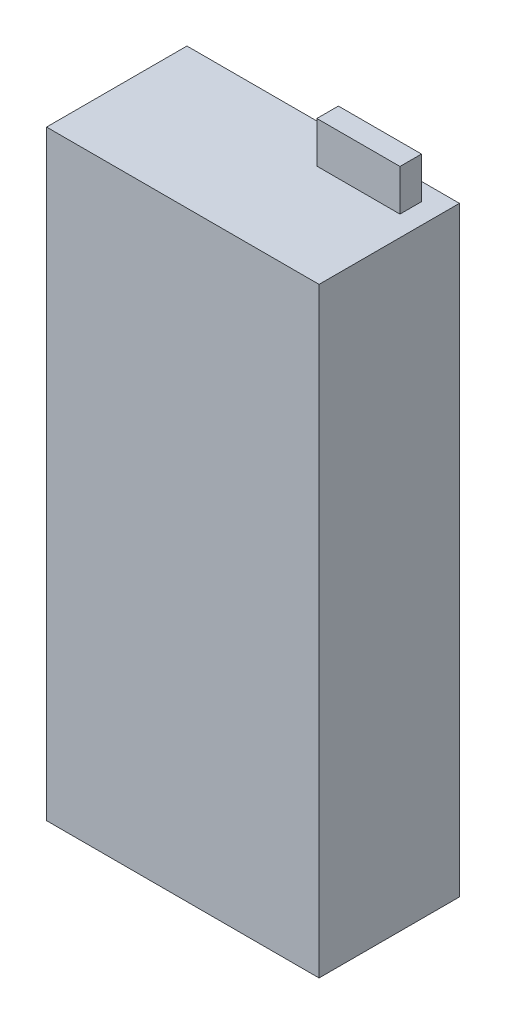
ISO-10303-21;
HEADER;
FILE_DESCRIPTION(('STEP AP214'),'2;1');
FILE_NAME('part.step','',(''),(''),'','','');
FILE_SCHEMA(('AUTOMOTIVE_DESIGN { 1 0 10303 214 1 1 1 1 }'));
ENDSEC;
DATA;
#1=APPLICATION_CONTEXT('core data for automotive mechanical design processes');
#2=APPLICATION_PROTOCOL_DEFINITION('international standard','automotive_design',2000,#1);
#3=PRODUCT_CONTEXT('',#1,'mechanical');
#4=PRODUCT('Part','Part','',(#3));
#5=PRODUCT_RELATED_PRODUCT_CATEGORY('part','',(#4));
#6=PRODUCT_DEFINITION_FORMATION('','',#4);
#7=PRODUCT_DEFINITION_CONTEXT('part definition',#1,'design');
#8=PRODUCT_DEFINITION('design','',#6,#7);
#9=PRODUCT_DEFINITION_SHAPE('','',#8);
#10=(LENGTH_UNIT() NAMED_UNIT(*) SI_UNIT(.MILLI.,.METRE.));
#11=(NAMED_UNIT(*) PLANE_ANGLE_UNIT() SI_UNIT($,.RADIAN.));
#12=(NAMED_UNIT(*) SI_UNIT($,.STERADIAN.) SOLID_ANGLE_UNIT());
#13=UNCERTAINTY_MEASURE_WITH_UNIT(LENGTH_MEASURE(1.E-05),#10,'distance_accuracy_value','');
#14=(GEOMETRIC_REPRESENTATION_CONTEXT(3) GLOBAL_UNCERTAINTY_ASSIGNED_CONTEXT((#13)) GLOBAL_UNIT_ASSIGNED_CONTEXT((#10,
#11,#12)) REPRESENTATION_CONTEXT('',''));
#15=CARTESIAN_POINT('',(0.,0.,0.));
#16=DIRECTION('',(0.,0.,1.));
#17=DIRECTION('',(1.,0.,0.));
#18=AXIS2_PLACEMENT_3D('',#15,#16,#17);
#19=CARTESIAN_POINT('',(-193.074626865671,287.149253731343,68.));
#20=DIRECTION('',(0.,-1.,0.));
#21=DIRECTION('',(0.,0.,-1.));
#22=AXIS2_PLACEMENT_3D('',#19,#20,#21);
#23=PLANE('',#22);
#24=DIRECTION('',(-1.,0.,0.));
#25=VECTOR('',#24,1.);
#26=CARTESIAN_POINT('',(-193.074626865671,287.149253731343,0.));
#27=LINE('',#26,#25);
#28=CARTESIAN_POINT('',(-61.0746268656714,287.149253731343,0.));
#29=VERTEX_POINT('',#28);
#30=CARTESIAN_POINT('',(-193.074626865671,287.149253731343,0.));
#31=VERTEX_POINT('',#30);
#32=EDGE_CURVE('E246',#29,#31,#27,.T.);
#33=ORIENTED_EDGE('',*,*,#32,.T.);
#34=DIRECTION('',(0.,0.,-1.));
#35=VECTOR('',#34,1.);
#36=CARTESIAN_POINT('',(-193.074626865671,287.149253731343,68.));
#37=LINE('',#36,#35);
#38=CARTESIAN_POINT('',(-193.074626865671,287.149253731343,68.));
#39=VERTEX_POINT('',#38);
#40=EDGE_CURVE('E256',#39,#31,#37,.T.);
#41=ORIENTED_EDGE('',*,*,#40,.F.);
#42=DIRECTION('',(-1.,0.,0.));
#43=VECTOR('',#42,1.);
#44=CARTESIAN_POINT('',(-193.074626865671,287.149253731343,68.));
#45=LINE('',#44,#43);
#46=CARTESIAN_POINT('',(-61.0746268656714,287.149253731343,68.));
#47=VERTEX_POINT('',#46);
#48=EDGE_CURVE('E236',#47,#39,#45,.T.);
#49=ORIENTED_EDGE('',*,*,#48,.F.);
#50=DIRECTION('',(0.,0.,-1.));
#51=VECTOR('',#50,1.);
#52=CARTESIAN_POINT('',(-61.0746268656714,287.149253731343,68.));
#53=LINE('',#52,#51);
#54=EDGE_CURVE('E41',#47,#29,#53,.T.);
#55=ORIENTED_EDGE('',*,*,#54,.T.);
#56=EDGE_LOOP('',(#33,#41,#49,#55));
#57=FACE_BOUND('',#56,.T.);
#58=DIRECTION('',(0.,0.,-1.));
#59=VECTOR('',#58,1.);
#60=CARTESIAN_POINT('',(-70.9483850455754,287.149253731343,18.9315760103987));
#61=LINE('',#60,#59);
#62=CARTESIAN_POINT('',(-70.9483850455754,287.149253731343,18.9315760103987));
#63=VERTEX_POINT('',#62);
#64=CARTESIAN_POINT('',(-70.9483850455754,287.149253731343,8.50918604596274));
#65=VERTEX_POINT('',#64);
#66=EDGE_CURVE('E142',#63,#65,#61,.T.);
#67=ORIENTED_EDGE('',*,*,#66,.F.);
#68=DIRECTION('',(1.,0.,0.));
#69=VECTOR('',#68,1.);
#70=CARTESIAN_POINT('',(-70.9483850455754,287.149253731343,18.9315760103987));
#71=LINE('',#70,#69);
#72=CARTESIAN_POINT('',(-111.202194247014,287.149253731343,18.9315760103987));
#73=VERTEX_POINT('',#72);
#74=EDGE_CURVE('E139',#73,#63,#71,.T.);
#75=ORIENTED_EDGE('',*,*,#74,.F.);
#76=DIRECTION('',(0.,0.,1.));
#77=VECTOR('',#76,1.);
#78=CARTESIAN_POINT('',(-111.202194247014,287.149253731343,18.9315760103987));
#79=LINE('',#78,#77);
#80=CARTESIAN_POINT('',(-111.202194247014,287.149253731343,8.50918604596274));
#81=VERTEX_POINT('',#80);
#82=EDGE_CURVE('E53',#81,#73,#79,.T.);
#83=ORIENTED_EDGE('',*,*,#82,.F.);
#84=DIRECTION('',(-1.,0.,0.));
#85=VECTOR('',#84,1.);
#86=CARTESIAN_POINT('',(-70.9483850455754,287.149253731343,8.50918604596274));
#87=LINE('',#86,#85);
#88=EDGE_CURVE('E48',#65,#81,#87,.T.);
#89=ORIENTED_EDGE('',*,*,#88,.F.);
#90=EDGE_LOOP('',(#67,#75,#83,#89));
#91=FACE_BOUND('',#90,.T.);
#92=ADVANCED_FACE('F33',(#57,#91),#23,.F.);
#93=CARTESIAN_POINT('',(-193.074626865671,-3.85074626865733,68.));
#94=DIRECTION('',(0.,1.,0.));
#95=DIRECTION('',(0.,0.,1.));
#96=AXIS2_PLACEMENT_3D('',#93,#94,#95);
#97=PLANE('',#96);
#98=CARTESIAN_POINT('',(-94.2518577073983,-3.85074626865733,37.5871900616787));
#99=DIRECTION('',(0.,1.,0.));
#100=DIRECTION('',(0.,0.,1.));
#101=AXIS2_PLACEMENT_3D('',#98,#99,#100);
#102=CIRCLE('',#101,24.1206050750484);
#103=CARTESIAN_POINT('',(-94.2518577073983,-3.85074626865733,61.707795136727));
#104=VERTEX_POINT('',#103);
#105=EDGE_CURVE('E11',#104,#104,#102,.F.);
#106=ORIENTED_EDGE('',*,*,#105,.F.);
#107=EDGE_LOOP('',(#106));
#108=FACE_BOUND('',#107,.T.);
#109=DIRECTION('',(1.,0.,0.));
#110=VECTOR('',#109,1.);
#111=CARTESIAN_POINT('',(-193.074626865671,-3.85074626865733,0.));
#112=LINE('',#111,#110);
#113=CARTESIAN_POINT('',(-193.074626865671,-3.85074626865733,0.));
#114=VERTEX_POINT('',#113);
#115=CARTESIAN_POINT('',(-61.0746268656714,-3.85074626865733,0.));
#116=VERTEX_POINT('',#115);
#117=EDGE_CURVE('E237',#114,#116,#112,.T.);
#118=ORIENTED_EDGE('',*,*,#117,.T.);
#119=DIRECTION('',(0.,0.,-1.));
#120=VECTOR('',#119,1.);
#121=CARTESIAN_POINT('',(-61.0746268656714,-3.85074626865733,68.));
#122=LINE('',#121,#120);
#123=CARTESIAN_POINT('',(-61.0746268656714,-3.85074626865733,68.));
#124=VERTEX_POINT('',#123);
#125=EDGE_CURVE('E243',#124,#116,#122,.T.);
#126=ORIENTED_EDGE('',*,*,#125,.F.);
#127=DIRECTION('',(1.,0.,0.));
#128=VECTOR('',#127,1.);
#129=CARTESIAN_POINT('',(-193.074626865671,-3.85074626865733,68.));
#130=LINE('',#129,#128);
#131=CARTESIAN_POINT('',(-193.074626865671,-3.85074626865733,68.));
#132=VERTEX_POINT('',#131);
#133=EDGE_CURVE('E241',#132,#124,#130,.T.);
#134=ORIENTED_EDGE('',*,*,#133,.F.);
#135=DIRECTION('',(0.,0.,-1.));
#136=VECTOR('',#135,1.);
#137=CARTESIAN_POINT('',(-193.074626865671,-3.85074626865733,68.));
#138=LINE('',#137,#136);
#139=EDGE_CURVE('E253',#132,#114,#138,.T.);
#140=ORIENTED_EDGE('',*,*,#139,.T.);
#141=EDGE_LOOP('',(#118,#126,#134,#140));
#142=FACE_BOUND('',#141,.T.);
#143=DIRECTION('',(0.,0.,-1.));
#144=VECTOR('',#143,1.);
#145=CARTESIAN_POINT('',(-178.598349927007,-3.85074626865733,24.2213644367162));
#146=LINE('',#145,#144);
#147=CARTESIAN_POINT('',(-178.598349927007,-3.85074626865733,24.2213644367162));
#148=VERTEX_POINT('',#147);
#149=CARTESIAN_POINT('',(-178.598349927007,-3.85074626865733,14.0191888236423));
#150=VERTEX_POINT('',#149);
#151=EDGE_CURVE('E146',#148,#150,#146,.T.);
#152=ORIENTED_EDGE('',*,*,#151,.F.);
#153=DIRECTION('',(-1.,0.,0.));
#154=VECTOR('',#153,1.);
#155=CARTESIAN_POINT('',(-178.598349927007,-3.85074626865733,24.2213644367162));
#156=LINE('',#155,#154);
#157=CARTESIAN_POINT('',(-125.545069393354,-3.85074626865733,24.2213644367162));
#158=VERTEX_POINT('',#157);
#159=EDGE_CURVE('E156',#158,#148,#156,.T.);
#160=ORIENTED_EDGE('',*,*,#159,.F.);
#161=DIRECTION('',(0.,0.,1.));
#162=VECTOR('',#161,1.);
#163=CARTESIAN_POINT('',(-125.545069393354,-3.85074626865733,24.2213644367162));
#164=LINE('',#163,#162);
#165=CARTESIAN_POINT('',(-125.545069393354,-3.85074626865733,14.0191888236423));
#166=VERTEX_POINT('',#165);
#167=EDGE_CURVE('E168',#166,#158,#164,.T.);
#168=ORIENTED_EDGE('',*,*,#167,.F.);
#169=DIRECTION('',(1.,0.,0.));
#170=VECTOR('',#169,1.);
#171=CARTESIAN_POINT('',(-178.598349927007,-3.85074626865733,14.0191888236423));
#172=LINE('',#171,#170);
#173=EDGE_CURVE('E165',#150,#166,#172,.T.);
#174=ORIENTED_EDGE('',*,*,#173,.F.);
#175=EDGE_LOOP('',(#152,#160,#168,#174));
#176=FACE_BOUND('',#175,.T.);
#177=ADVANCED_FACE('F276',(#108,#142,#176),#97,.F.);
#178=CARTESIAN_POINT('',(-61.0746268656714,287.149253731343,68.));
#179=DIRECTION('',(-1.,0.,0.));
#180=DIRECTION('',(0.,-1.,0.));
#181=AXIS2_PLACEMENT_3D('',#178,#179,#180);
#182=PLANE('',#181);
#183=DIRECTION('',(0.,1.,0.));
#184=VECTOR('',#183,1.);
#185=CARTESIAN_POINT('',(-61.0746268656714,287.149253731343,0.));
#186=LINE('',#185,#184);
#187=EDGE_CURVE('E230',#116,#29,#186,.T.);
#188=ORIENTED_EDGE('',*,*,#187,.T.);
#189=ORIENTED_EDGE('',*,*,#54,.F.);
#190=DIRECTION('',(0.,1.,0.));
#191=VECTOR('',#190,1.);
#192=CARTESIAN_POINT('',(-61.0746268656714,287.149253731343,68.));
#193=LINE('',#192,#191);
#194=EDGE_CURVE('E233',#124,#47,#193,.T.);
#195=ORIENTED_EDGE('',*,*,#194,.F.);
#196=ORIENTED_EDGE('',*,*,#125,.T.);
#197=EDGE_LOOP('',(#188,#189,#195,#196));
#198=FACE_BOUND('',#197,.T.);
#199=ADVANCED_FACE('F35',(#198),#182,.F.);
#200=CARTESIAN_POINT('',(-193.074626865671,287.149253731343,68.));
#201=DIRECTION('',(1.,0.,0.));
#202=DIRECTION('',(0.,1.,0.));
#203=AXIS2_PLACEMENT_3D('',#200,#201,#202);
#204=PLANE('',#203);
#205=CARTESIAN_POINT('',(-193.074626865671,23.1492537313427,55.5));
#206=DIRECTION('',(-1.,0.,0.));
#207=DIRECTION('',(0.,-1.,0.));
#208=AXIS2_PLACEMENT_3D('',#205,#206,#207);
#209=CIRCLE('',#208,2.);
#210=CARTESIAN_POINT('',(-193.074626865671,21.1492537313427,55.5));
#211=VERTEX_POINT('',#210);
#212=EDGE_CURVE('E207',#211,#211,#209,.T.);
#213=ORIENTED_EDGE('',*,*,#212,.F.);
#214=EDGE_LOOP('',(#213));
#215=FACE_BOUND('',#214,.T.);
#216=CARTESIAN_POINT('',(-193.074626865671,33.1492537313427,55.5));
#217=DIRECTION('',(-1.,0.,0.));
#218=DIRECTION('',(0.,-1.,0.));
#219=AXIS2_PLACEMENT_3D('',#216,#217,#218);
#220=CIRCLE('',#219,2.);
#221=CARTESIAN_POINT('',(-193.074626865671,31.1492537313427,55.5));
#222=VERTEX_POINT('',#221);
#223=EDGE_CURVE('E213',#222,#222,#220,.T.);
#224=ORIENTED_EDGE('',*,*,#223,.F.);
#225=EDGE_LOOP('',(#224));
#226=FACE_BOUND('',#225,.T.);
#227=CARTESIAN_POINT('',(-193.074626865671,33.1492537313427,17.5));
#228=DIRECTION('',(-1.,0.,0.));
#229=DIRECTION('',(0.,-1.,0.));
#230=AXIS2_PLACEMENT_3D('',#227,#228,#229);
#231=CIRCLE('',#230,2.);
#232=CARTESIAN_POINT('',(-193.074626865671,31.1492537313427,17.5));
#233=VERTEX_POINT('',#232);
#234=EDGE_CURVE('E219',#233,#233,#231,.T.);
#235=ORIENTED_EDGE('',*,*,#234,.F.);
#236=EDGE_LOOP('',(#235));
#237=FACE_BOUND('',#236,.T.);
#238=CARTESIAN_POINT('',(-193.074626865671,269.449253731343,17.5));
#239=DIRECTION('',(-1.,0.,0.));
#240=DIRECTION('',(0.,1.,0.));
#241=AXIS2_PLACEMENT_3D('',#238,#239,#240);
#242=CIRCLE('',#241,2.00000000000001);
#243=CARTESIAN_POINT('',(-193.074626865671,271.449253731343,17.5));
#244=VERTEX_POINT('',#243);
#245=EDGE_CURVE('E188',#244,#244,#242,.T.);
#246=ORIENTED_EDGE('',*,*,#245,.F.);
#247=EDGE_LOOP('',(#246));
#248=FACE_BOUND('',#247,.T.);
#249=CARTESIAN_POINT('',(-193.074626865671,259.449253731343,17.5));
#250=DIRECTION('',(-1.,0.,0.));
#251=DIRECTION('',(0.,1.,0.));
#252=AXIS2_PLACEMENT_3D('',#249,#250,#251);
#253=CIRCLE('',#252,2.);
#254=CARTESIAN_POINT('',(-193.074626865671,261.449253731343,17.5));
#255=VERTEX_POINT('',#254);
#256=EDGE_CURVE('E189',#255,#255,#253,.T.);
#257=ORIENTED_EDGE('',*,*,#256,.F.);
#258=EDGE_LOOP('',(#257));
#259=FACE_BOUND('',#258,.T.);
#260=CARTESIAN_POINT('',(-193.074626865671,259.449253731343,55.5));
#261=DIRECTION('',(-1.,0.,0.));
#262=DIRECTION('',(0.,1.,0.));
#263=AXIS2_PLACEMENT_3D('',#260,#261,#262);
#264=CIRCLE('',#263,2.);
#265=CARTESIAN_POINT('',(-193.074626865671,261.449253731343,55.5));
#266=VERTEX_POINT('',#265);
#267=EDGE_CURVE('E195',#266,#266,#264,.T.);
#268=ORIENTED_EDGE('',*,*,#267,.F.);
#269=EDGE_LOOP('',(#268));
#270=FACE_BOUND('',#269,.T.);
#271=CARTESIAN_POINT('',(-193.074626865671,269.449253731343,55.5));
#272=DIRECTION('',(-1.,0.,0.));
#273=DIRECTION('',(0.,1.,0.));
#274=AXIS2_PLACEMENT_3D('',#271,#272,#273);
#275=CIRCLE('',#274,2.);
#276=CARTESIAN_POINT('',(-193.074626865671,271.449253731343,55.5));
#277=VERTEX_POINT('',#276);
#278=EDGE_CURVE('E184',#277,#277,#275,.T.);
#279=ORIENTED_EDGE('',*,*,#278,.F.);
#280=EDGE_LOOP('',(#279));
#281=FACE_BOUND('',#280,.T.);
#282=CARTESIAN_POINT('',(-193.074626865671,23.1492537313427,17.5));
#283=DIRECTION('',(-1.,0.,0.));
#284=DIRECTION('',(0.,-1.,0.));
#285=AXIS2_PLACEMENT_3D('',#282,#283,#284);
#286=CIRCLE('',#285,2.);
#287=CARTESIAN_POINT('',(-193.074626865671,21.1492537313427,17.5));
#288=VERTEX_POINT('',#287);
#289=EDGE_CURVE('E206',#288,#288,#286,.T.);
#290=ORIENTED_EDGE('',*,*,#289,.F.);
#291=EDGE_LOOP('',(#290));
#292=FACE_BOUND('',#291,.T.);
#293=DIRECTION('',(0.,-1.,0.));
#294=VECTOR('',#293,1.);
#295=CARTESIAN_POINT('',(-193.074626865671,287.149253731343,0.));
#296=LINE('',#295,#294);
#297=EDGE_CURVE('E248',#31,#114,#296,.T.);
#298=ORIENTED_EDGE('',*,*,#297,.T.);
#299=ORIENTED_EDGE('',*,*,#139,.F.);
#300=DIRECTION('',(0.,-1.,0.));
#301=VECTOR('',#300,1.);
#302=CARTESIAN_POINT('',(-193.074626865671,287.149253731343,68.));
#303=LINE('',#302,#301);
#304=EDGE_CURVE('E239',#39,#132,#303,.T.);
#305=ORIENTED_EDGE('',*,*,#304,.F.);
#306=ORIENTED_EDGE('',*,*,#40,.T.);
#307=EDGE_LOOP('',(#298,#299,#305,#306));
#308=FACE_BOUND('',#307,.T.);
#309=ADVANCED_FACE('F272',(#215,#226,#237,#248,#259,#270,#281,#292,#308),#204,.F.);
#310=CARTESIAN_POINT('',(0.,0.,68.));
#311=DIRECTION('',(0.,0.,1.));
#312=DIRECTION('',(1.,0.,0.));
#313=AXIS2_PLACEMENT_3D('',#310,#311,#312);
#314=PLANE('',#313);
#315=ORIENTED_EDGE('',*,*,#194,.T.);
#316=ORIENTED_EDGE('',*,*,#48,.T.);
#317=ORIENTED_EDGE('',*,*,#304,.T.);
#318=ORIENTED_EDGE('',*,*,#133,.T.);
#319=EDGE_LOOP('',(#315,#316,#317,#318));
#320=FACE_BOUND('',#319,.T.);
#321=ADVANCED_FACE('F279',(#320),#314,.T.);
#322=CARTESIAN_POINT('',(0.,0.,0.));
#323=DIRECTION('',(0.,0.,1.));
#324=DIRECTION('',(1.,0.,0.));
#325=AXIS2_PLACEMENT_3D('',#322,#323,#324);
#326=PLANE('',#325);
#327=ORIENTED_EDGE('',*,*,#187,.F.);
#328=ORIENTED_EDGE('',*,*,#117,.F.);
#329=ORIENTED_EDGE('',*,*,#297,.F.);
#330=ORIENTED_EDGE('',*,*,#32,.F.);
#331=EDGE_LOOP('',(#327,#328,#329,#330));
#332=FACE_BOUND('',#331,.T.);
#333=ADVANCED_FACE('F268',(#332),#326,.F.);
#334=CARTESIAN_POINT('',(-189.074626865671,23.1492537313427,17.5));
#335=DIRECTION('',(-1.,0.,0.));
#336=DIRECTION('',(0.,-1.,0.));
#337=AXIS2_PLACEMENT_3D('',#334,#335,#336);
#338=CYLINDRICAL_SURFACE('',#337,2.);
#339=CARTESIAN_POINT('',(-189.074626865671,23.1492537313427,17.5));
#340=DIRECTION('',(-1.,0.,0.));
#341=DIRECTION('',(0.,-1.,0.));
#342=AXIS2_PLACEMENT_3D('',#339,#340,#341);
#343=CIRCLE('',#342,2.);
#344=CARTESIAN_POINT('',(-189.074626865671,21.1492537313427,17.5));
#345=VERTEX_POINT('',#344);
#346=EDGE_CURVE('E227',#345,#345,#343,.T.);
#347=ORIENTED_EDGE('',*,*,#346,.F.);
#348=EDGE_LOOP('',(#347));
#349=FACE_BOUND('',#348,.T.);
#350=ORIENTED_EDGE('',*,*,#289,.T.);
#351=EDGE_LOOP('',(#350));
#352=FACE_BOUND('',#351,.T.);
#353=ADVANCED_FACE('F286',(#349,#352),#338,.F.);
#354=CARTESIAN_POINT('',(-189.074626865671,23.1492537313427,17.5));
#355=DIRECTION('',(-1.,0.,0.));
#356=DIRECTION('',(0.,-1.,0.));
#357=AXIS2_PLACEMENT_3D('',#354,#355,#356);
#358=PLANE('',#357);
#359=ORIENTED_EDGE('',*,*,#346,.T.);
#360=EDGE_LOOP('',(#359));
#361=FACE_BOUND('',#360,.T.);
#362=ADVANCED_FACE('F360',(#361),#358,.T.);
#363=CARTESIAN_POINT('',(-189.074626865671,269.449253731343,55.5));
#364=DIRECTION('',(-1.,0.,0.));
#365=DIRECTION('',(0.,-1.,0.));
#366=AXIS2_PLACEMENT_3D('',#363,#364,#365);
#367=CYLINDRICAL_SURFACE('',#366,2.);
#368=CARTESIAN_POINT('',(-189.074626865671,269.449253731343,55.5));
#369=DIRECTION('',(-1.,0.,0.));
#370=DIRECTION('',(0.,1.,0.));
#371=AXIS2_PLACEMENT_3D('',#368,#369,#370);
#372=CIRCLE('',#371,2.);
#373=CARTESIAN_POINT('',(-189.074626865671,271.449253731343,55.5));
#374=VERTEX_POINT('',#373);
#375=EDGE_CURVE('E198',#374,#374,#372,.T.);
#376=ORIENTED_EDGE('',*,*,#375,.F.);
#377=EDGE_LOOP('',(#376));
#378=FACE_BOUND('',#377,.T.);
#379=ORIENTED_EDGE('',*,*,#278,.T.);
#380=EDGE_LOOP('',(#379));
#381=FACE_BOUND('',#380,.T.);
#382=ADVANCED_FACE('F356',(#378,#381),#367,.F.);
#383=CARTESIAN_POINT('',(-189.074626865671,269.449253731343,55.5));
#384=DIRECTION('',(1.,0.,0.));
#385=DIRECTION('',(0.,1.,0.));
#386=AXIS2_PLACEMENT_3D('',#383,#384,#385);
#387=PLANE('',#386);
#388=ORIENTED_EDGE('',*,*,#375,.T.);
#389=EDGE_LOOP('',(#388));
#390=FACE_BOUND('',#389,.T.);
#391=ADVANCED_FACE('F352',(#390),#387,.F.);
#392=CARTESIAN_POINT('',(-189.074626865671,259.449253731343,55.5));
#393=DIRECTION('',(-1.,0.,0.));
#394=DIRECTION('',(0.,-1.,0.));
#395=AXIS2_PLACEMENT_3D('',#392,#393,#394);
#396=CYLINDRICAL_SURFACE('',#395,2.);
#397=CARTESIAN_POINT('',(-189.074626865671,259.449253731343,55.5));
#398=DIRECTION('',(-1.,0.,0.));
#399=DIRECTION('',(0.,1.,0.));
#400=AXIS2_PLACEMENT_3D('',#397,#398,#399);
#401=CIRCLE('',#400,2.);
#402=CARTESIAN_POINT('',(-189.074626865671,261.449253731343,55.5));
#403=VERTEX_POINT('',#402);
#404=EDGE_CURVE('E192',#403,#403,#401,.T.);
#405=ORIENTED_EDGE('',*,*,#404,.F.);
#406=EDGE_LOOP('',(#405));
#407=FACE_BOUND('',#406,.T.);
#408=ORIENTED_EDGE('',*,*,#267,.T.);
#409=EDGE_LOOP('',(#408));
#410=FACE_BOUND('',#409,.T.);
#411=ADVANCED_FACE('F348',(#407,#410),#396,.F.);
#412=CARTESIAN_POINT('',(-189.074626865671,259.449253731343,55.5));
#413=DIRECTION('',(1.,0.,0.));
#414=DIRECTION('',(0.,1.,0.));
#415=AXIS2_PLACEMENT_3D('',#412,#413,#414);
#416=PLANE('',#415);
#417=ORIENTED_EDGE('',*,*,#404,.T.);
#418=EDGE_LOOP('',(#417));
#419=FACE_BOUND('',#418,.T.);
#420=ADVANCED_FACE('F344',(#419),#416,.F.);
#421=CARTESIAN_POINT('',(-189.074626865671,259.449253731343,17.5));
#422=DIRECTION('',(-1.,0.,0.));
#423=DIRECTION('',(0.,-1.,0.));
#424=AXIS2_PLACEMENT_3D('',#421,#422,#423);
#425=CYLINDRICAL_SURFACE('',#424,2.);
#426=CARTESIAN_POINT('',(-189.074626865671,259.449253731343,17.5));
#427=DIRECTION('',(-1.,0.,0.));
#428=DIRECTION('',(0.,1.,0.));
#429=AXIS2_PLACEMENT_3D('',#426,#427,#428);
#430=CIRCLE('',#429,2.);
#431=CARTESIAN_POINT('',(-189.074626865671,261.449253731343,17.5));
#432=VERTEX_POINT('',#431);
#433=EDGE_CURVE('E185',#432,#432,#430,.T.);
#434=ORIENTED_EDGE('',*,*,#433,.F.);
#435=EDGE_LOOP('',(#434));
#436=FACE_BOUND('',#435,.T.);
#437=ORIENTED_EDGE('',*,*,#256,.T.);
#438=EDGE_LOOP('',(#437));
#439=FACE_BOUND('',#438,.T.);
#440=ADVANCED_FACE('F340',(#436,#439),#425,.F.);
#441=CARTESIAN_POINT('',(-189.074626865671,259.449253731343,17.5));
#442=DIRECTION('',(1.,0.,0.));
#443=DIRECTION('',(0.,1.,0.));
#444=AXIS2_PLACEMENT_3D('',#441,#442,#443);
#445=PLANE('',#444);
#446=ORIENTED_EDGE('',*,*,#433,.T.);
#447=EDGE_LOOP('',(#446));
#448=FACE_BOUND('',#447,.T.);
#449=ADVANCED_FACE('F336',(#448),#445,.F.);
#450=CARTESIAN_POINT('',(-189.074626865671,269.449253731343,17.5));
#451=DIRECTION('',(-1.,0.,0.));
#452=DIRECTION('',(0.,-1.,0.));
#453=AXIS2_PLACEMENT_3D('',#450,#451,#452);
#454=CYLINDRICAL_SURFACE('',#453,2.00000000000001);
#455=CARTESIAN_POINT('',(-189.074626865671,269.449253731343,17.5));
#456=DIRECTION('',(-1.,0.,0.));
#457=DIRECTION('',(0.,1.,0.));
#458=AXIS2_PLACEMENT_3D('',#455,#456,#457);
#459=CIRCLE('',#458,2.00000000000001);
#460=CARTESIAN_POINT('',(-189.074626865671,271.449253731343,17.5));
#461=VERTEX_POINT('',#460);
#462=EDGE_CURVE('E222',#461,#461,#459,.T.);
#463=ORIENTED_EDGE('',*,*,#462,.F.);
#464=EDGE_LOOP('',(#463));
#465=FACE_BOUND('',#464,.T.);
#466=ORIENTED_EDGE('',*,*,#245,.T.);
#467=EDGE_LOOP('',(#466));
#468=FACE_BOUND('',#467,.T.);
#469=ADVANCED_FACE('F339',(#465,#468),#454,.F.);
#470=CARTESIAN_POINT('',(-189.074626865671,269.449253731343,17.5));
#471=DIRECTION('',(1.,0.,0.));
#472=DIRECTION('',(0.,1.,0.));
#473=AXIS2_PLACEMENT_3D('',#470,#471,#472);
#474=PLANE('',#473);
#475=ORIENTED_EDGE('',*,*,#462,.T.);
#476=EDGE_LOOP('',(#475));
#477=FACE_BOUND('',#476,.T.);
#478=ADVANCED_FACE('F384',(#477),#474,.F.);
#479=CARTESIAN_POINT('',(-189.074626865671,33.1492537313427,17.5));
#480=DIRECTION('',(-1.,0.,0.));
#481=DIRECTION('',(0.,-1.,0.));
#482=AXIS2_PLACEMENT_3D('',#479,#480,#481);
#483=CYLINDRICAL_SURFACE('',#482,2.);
#484=CARTESIAN_POINT('',(-189.074626865671,33.1492537313427,17.5));
#485=DIRECTION('',(-1.,0.,0.));
#486=DIRECTION('',(0.,-1.,0.));
#487=AXIS2_PLACEMENT_3D('',#484,#485,#486);
#488=CIRCLE('',#487,2.);
#489=CARTESIAN_POINT('',(-189.074626865671,31.1492537313427,17.5));
#490=VERTEX_POINT('',#489);
#491=EDGE_CURVE('E216',#490,#490,#488,.T.);
#492=ORIENTED_EDGE('',*,*,#491,.F.);
#493=EDGE_LOOP('',(#492));
#494=FACE_BOUND('',#493,.T.);
#495=ORIENTED_EDGE('',*,*,#234,.T.);
#496=EDGE_LOOP('',(#495));
#497=FACE_BOUND('',#496,.T.);
#498=ADVANCED_FACE('F380',(#494,#497),#483,.F.);
#499=CARTESIAN_POINT('',(-189.074626865671,33.1492537313427,17.5));
#500=DIRECTION('',(-1.,0.,0.));
#501=DIRECTION('',(0.,-1.,0.));
#502=AXIS2_PLACEMENT_3D('',#499,#500,#501);
#503=PLANE('',#502);
#504=ORIENTED_EDGE('',*,*,#491,.T.);
#505=EDGE_LOOP('',(#504));
#506=FACE_BOUND('',#505,.T.);
#507=ADVANCED_FACE('F376',(#506),#503,.T.);
#508=CARTESIAN_POINT('',(-189.074626865671,33.1492537313427,55.5));
#509=DIRECTION('',(-1.,0.,0.));
#510=DIRECTION('',(0.,-1.,0.));
#511=AXIS2_PLACEMENT_3D('',#508,#509,#510);
#512=CYLINDRICAL_SURFACE('',#511,2.);
#513=CARTESIAN_POINT('',(-189.074626865671,33.1492537313427,55.5));
#514=DIRECTION('',(-1.,0.,0.));
#515=DIRECTION('',(0.,-1.,0.));
#516=AXIS2_PLACEMENT_3D('',#513,#514,#515);
#517=CIRCLE('',#516,2.);
#518=CARTESIAN_POINT('',(-189.074626865671,31.1492537313427,55.5));
#519=VERTEX_POINT('',#518);
#520=EDGE_CURVE('E210',#519,#519,#517,.T.);
#521=ORIENTED_EDGE('',*,*,#520,.F.);
#522=EDGE_LOOP('',(#521));
#523=FACE_BOUND('',#522,.T.);
#524=ORIENTED_EDGE('',*,*,#223,.T.);
#525=EDGE_LOOP('',(#524));
#526=FACE_BOUND('',#525,.T.);
#527=ADVANCED_FACE('F372',(#523,#526),#512,.F.);
#528=CARTESIAN_POINT('',(-189.074626865671,33.1492537313427,55.5));
#529=DIRECTION('',(-1.,0.,0.));
#530=DIRECTION('',(0.,-1.,0.));
#531=AXIS2_PLACEMENT_3D('',#528,#529,#530);
#532=PLANE('',#531);
#533=ORIENTED_EDGE('',*,*,#520,.T.);
#534=EDGE_LOOP('',(#533));
#535=FACE_BOUND('',#534,.T.);
#536=ADVANCED_FACE('F368',(#535),#532,.T.);
#537=CARTESIAN_POINT('',(-189.074626865671,23.1492537313427,55.5));
#538=DIRECTION('',(-1.,0.,0.));
#539=DIRECTION('',(0.,-1.,0.));
#540=AXIS2_PLACEMENT_3D('',#537,#538,#539);
#541=CYLINDRICAL_SURFACE('',#540,2.);
#542=CARTESIAN_POINT('',(-189.074626865671,23.1492537313427,55.5));
#543=DIRECTION('',(-1.,0.,0.));
#544=DIRECTION('',(0.,-1.,0.));
#545=AXIS2_PLACEMENT_3D('',#542,#543,#544);
#546=CIRCLE('',#545,2.);
#547=CARTESIAN_POINT('',(-189.074626865671,21.1492537313427,55.5));
#548=VERTEX_POINT('',#547);
#549=EDGE_CURVE('E203',#548,#548,#546,.T.);
#550=ORIENTED_EDGE('',*,*,#549,.F.);
#551=EDGE_LOOP('',(#550));
#552=FACE_BOUND('',#551,.T.);
#553=ORIENTED_EDGE('',*,*,#212,.T.);
#554=EDGE_LOOP('',(#553));
#555=FACE_BOUND('',#554,.T.);
#556=ADVANCED_FACE('F364',(#552,#555),#541,.F.);
#557=CARTESIAN_POINT('',(-189.074626865671,23.1492537313427,55.5));
#558=DIRECTION('',(-1.,0.,0.));
#559=DIRECTION('',(0.,-1.,0.));
#560=AXIS2_PLACEMENT_3D('',#557,#558,#559);
#561=PLANE('',#560);
#562=ORIENTED_EDGE('',*,*,#549,.T.);
#563=EDGE_LOOP('',(#562));
#564=FACE_BOUND('',#563,.T.);
#565=ADVANCED_FACE('F334',(#564),#561,.T.);
#566=CARTESIAN_POINT('',(-178.598349927007,-23.8507462686573,24.2213644367162));
#567=DIRECTION('',(1.,0.,0.));
#568=DIRECTION('',(0.,0.,-1.));
#569=AXIS2_PLACEMENT_3D('',#566,#567,#568);
#570=PLANE('',#569);
#571=ORIENTED_EDGE('',*,*,#151,.T.);
#572=DIRECTION('',(0.,1.,0.));
#573=VECTOR('',#572,1.);
#574=CARTESIAN_POINT('',(-178.598349927007,-23.8507462686573,14.0191888236423));
#575=LINE('',#574,#573);
#576=CARTESIAN_POINT('',(-178.598349927007,-23.8507462686573,14.0191888236423));
#577=VERTEX_POINT('',#576);
#578=EDGE_CURVE('E181',#577,#150,#575,.T.);
#579=ORIENTED_EDGE('',*,*,#578,.F.);
#580=DIRECTION('',(0.,0.,-1.));
#581=VECTOR('',#580,1.);
#582=CARTESIAN_POINT('',(-178.598349927007,-23.8507462686573,24.2213644367162));
#583=LINE('',#582,#581);
#584=CARTESIAN_POINT('',(-178.598349927007,-23.8507462686573,24.2213644367162));
#585=VERTEX_POINT('',#584);
#586=EDGE_CURVE('E152',#585,#577,#583,.T.);
#587=ORIENTED_EDGE('',*,*,#586,.F.);
#588=DIRECTION('',(0.,1.,0.));
#589=VECTOR('',#588,1.);
#590=CARTESIAN_POINT('',(-178.598349927007,-23.8507462686573,24.2213644367162));
#591=LINE('',#590,#589);
#592=EDGE_CURVE('E162',#585,#148,#591,.T.);
#593=ORIENTED_EDGE('',*,*,#592,.T.);
#594=EDGE_LOOP('',(#571,#579,#587,#593));
#595=FACE_BOUND('',#594,.T.);
#596=ADVANCED_FACE('F330',(#595),#570,.F.);
#597=CARTESIAN_POINT('',(-178.598349927007,-23.8507462686573,14.0191888236423));
#598=DIRECTION('',(0.,0.,1.));
#599=DIRECTION('',(1.,0.,0.));
#600=AXIS2_PLACEMENT_3D('',#597,#598,#599);
#601=PLANE('',#600);
#602=ORIENTED_EDGE('',*,*,#173,.T.);
#603=DIRECTION('',(0.,1.,0.));
#604=VECTOR('',#603,1.);
#605=CARTESIAN_POINT('',(-125.545069393354,-23.8507462686573,14.0191888236423));
#606=LINE('',#605,#604);
#607=CARTESIAN_POINT('',(-125.545069393354,-23.8507462686573,14.0191888236423));
#608=VERTEX_POINT('',#607);
#609=EDGE_CURVE('E178',#608,#166,#606,.T.);
#610=ORIENTED_EDGE('',*,*,#609,.F.);
#611=DIRECTION('',(1.,0.,0.));
#612=VECTOR('',#611,1.);
#613=CARTESIAN_POINT('',(-178.598349927007,-23.8507462686573,14.0191888236423));
#614=LINE('',#613,#612);
#615=EDGE_CURVE('E155',#577,#608,#614,.T.);
#616=ORIENTED_EDGE('',*,*,#615,.F.);
#617=ORIENTED_EDGE('',*,*,#578,.T.);
#618=EDGE_LOOP('',(#602,#610,#616,#617));
#619=FACE_BOUND('',#618,.T.);
#620=ADVANCED_FACE('F326',(#619),#601,.F.);
#621=CARTESIAN_POINT('',(-125.545069393354,-23.8507462686573,24.2213644367162));
#622=DIRECTION('',(-1.,0.,0.));
#623=DIRECTION('',(0.,0.,1.));
#624=AXIS2_PLACEMENT_3D('',#621,#622,#623);
#625=PLANE('',#624);
#626=ORIENTED_EDGE('',*,*,#167,.T.);
#627=DIRECTION('',(0.,1.,0.));
#628=VECTOR('',#627,1.);
#629=CARTESIAN_POINT('',(-125.545069393354,-23.8507462686573,24.2213644367162));
#630=LINE('',#629,#628);
#631=CARTESIAN_POINT('',(-125.545069393354,-23.8507462686573,24.2213644367162));
#632=VERTEX_POINT('',#631);
#633=EDGE_CURVE('E175',#632,#158,#630,.T.);
#634=ORIENTED_EDGE('',*,*,#633,.F.);
#635=DIRECTION('',(0.,0.,1.));
#636=VECTOR('',#635,1.);
#637=CARTESIAN_POINT('',(-125.545069393354,-23.8507462686573,24.2213644367162));
#638=LINE('',#637,#636);
#639=EDGE_CURVE('E158',#608,#632,#638,.T.);
#640=ORIENTED_EDGE('',*,*,#639,.F.);
#641=ORIENTED_EDGE('',*,*,#609,.T.);
#642=EDGE_LOOP('',(#626,#634,#640,#641));
#643=FACE_BOUND('',#642,.T.);
#644=ADVANCED_FACE('F322',(#643),#625,.F.);
#645=CARTESIAN_POINT('',(-178.598349927007,-23.8507462686573,24.2213644367162));
#646=DIRECTION('',(0.,0.,-1.));
#647=DIRECTION('',(-1.,0.,0.));
#648=AXIS2_PLACEMENT_3D('',#645,#646,#647);
#649=PLANE('',#648);
#650=ORIENTED_EDGE('',*,*,#159,.T.);
#651=ORIENTED_EDGE('',*,*,#592,.F.);
#652=DIRECTION('',(-1.,0.,0.));
#653=VECTOR('',#652,1.);
#654=CARTESIAN_POINT('',(-178.598349927007,-23.8507462686573,24.2213644367162));
#655=LINE('',#654,#653);
#656=EDGE_CURVE('E160',#632,#585,#655,.T.);
#657=ORIENTED_EDGE('',*,*,#656,.F.);
#658=ORIENTED_EDGE('',*,*,#633,.T.);
#659=EDGE_LOOP('',(#650,#651,#657,#658));
#660=FACE_BOUND('',#659,.T.);
#661=ADVANCED_FACE('F314',(#660),#649,.F.);
#662=CARTESIAN_POINT('',(0.,-23.8507462686573,0.));
#663=DIRECTION('',(0.,-1.,0.));
#664=DIRECTION('',(0.,0.,-1.));
#665=AXIS2_PLACEMENT_3D('',#662,#663,#664);
#666=PLANE('',#665);
#667=ORIENTED_EDGE('',*,*,#586,.T.);
#668=ORIENTED_EDGE('',*,*,#615,.T.);
#669=ORIENTED_EDGE('',*,*,#639,.T.);
#670=ORIENTED_EDGE('',*,*,#656,.T.);
#671=EDGE_LOOP('',(#667,#668,#669,#670));
#672=FACE_BOUND('',#671,.T.);
#673=ADVANCED_FACE('F305',(#672),#666,.T.);
#674=CARTESIAN_POINT('',(-94.2518577073983,-8.85074626865734,37.5871900616787));
#675=DIRECTION('',(0.,1.,0.));
#676=DIRECTION('',(0.,0.,1.));
#677=AXIS2_PLACEMENT_3D('',#674,#675,#676);
#678=CYLINDRICAL_SURFACE('',#677,24.1206050750484);
#679=CARTESIAN_POINT('',(-94.2518577073983,-8.85074626865734,37.5871900616787));
#680=DIRECTION('',(0.,-1.,0.));
#681=DIRECTION('',(0.,0.,-1.));
#682=AXIS2_PLACEMENT_3D('',#679,#680,#681);
#683=CIRCLE('',#682,24.1206050750484);
#684=CARTESIAN_POINT('',(-94.2518577073983,-8.85074626865734,13.4665849866303));
#685=VERTEX_POINT('',#684);
#686=EDGE_CURVE('E143',#685,#685,#683,.T.);
#687=ORIENTED_EDGE('',*,*,#686,.F.);
#688=EDGE_LOOP('',(#687));
#689=FACE_BOUND('',#688,.T.);
#690=ORIENTED_EDGE('',*,*,#105,.T.);
#691=EDGE_LOOP('',(#690));
#692=FACE_BOUND('',#691,.T.);
#693=ADVANCED_FACE('F302',(#689,#692),#678,.T.);
#694=CARTESIAN_POINT('',(-94.2518577073983,-8.85074626865734,37.5871900616787));
#695=DIRECTION('',(0.,-1.,0.));
#696=DIRECTION('',(0.,0.,-1.));
#697=AXIS2_PLACEMENT_3D('',#694,#695,#696);
#698=PLANE('',#697);
#699=ORIENTED_EDGE('',*,*,#686,.T.);
#700=EDGE_LOOP('',(#699));
#701=FACE_BOUND('',#700,.T.);
#702=ADVANCED_FACE('F304',(#701),#698,.T.);
#703=CARTESIAN_POINT('',(-70.9483850455754,307.149253731343,18.9315760103987));
#704=DIRECTION('',(-1.,0.,0.));
#705=DIRECTION('',(0.,0.,1.));
#706=AXIS2_PLACEMENT_3D('',#703,#704,#705);
#707=PLANE('',#706);
#708=ORIENTED_EDGE('',*,*,#66,.T.);
#709=DIRECTION('',(0.,-1.,0.));
#710=VECTOR('',#709,1.);
#711=CARTESIAN_POINT('',(-70.9483850455754,307.149253731343,8.50918604596274));
#712=LINE('',#711,#710);
#713=CARTESIAN_POINT('',(-70.9483850455754,307.149253731343,8.50918604596274));
#714=VERTEX_POINT('',#713);
#715=EDGE_CURVE('E123',#714,#65,#712,.T.);
#716=ORIENTED_EDGE('',*,*,#715,.F.);
#717=DIRECTION('',(0.,0.,-1.));
#718=VECTOR('',#717,1.);
#719=CARTESIAN_POINT('',(-70.9483850455754,307.149253731343,18.9315760103987));
#720=LINE('',#719,#718);
#721=CARTESIAN_POINT('',(-70.9483850455754,307.149253731343,18.9315760103987));
#722=VERTEX_POINT('',#721);
#723=EDGE_CURVE('E130',#722,#714,#720,.T.);
#724=ORIENTED_EDGE('',*,*,#723,.F.);
#725=DIRECTION('',(0.,-1.,0.));
#726=VECTOR('',#725,1.);
#727=CARTESIAN_POINT('',(-70.9483850455754,307.149253731343,18.9315760103987));
#728=LINE('',#727,#726);
#729=EDGE_CURVE('E552',#722,#63,#728,.T.);
#730=ORIENTED_EDGE('',*,*,#729,.T.);
#731=EDGE_LOOP('',(#708,#716,#724,#730));
#732=FACE_BOUND('',#731,.T.);
#733=ADVANCED_FACE('F141',(#732),#707,.F.);
#734=CARTESIAN_POINT('',(-70.9483850455754,307.149253731343,8.50918604596274));
#735=DIRECTION('',(0.,0.,1.));
#736=DIRECTION('',(1.,0.,0.));
#737=AXIS2_PLACEMENT_3D('',#734,#735,#736);
#738=PLANE('',#737);
#739=ORIENTED_EDGE('',*,*,#88,.T.);
#740=DIRECTION('',(0.,-1.,0.));
#741=VECTOR('',#740,1.);
#742=CARTESIAN_POINT('',(-111.202194247014,307.149253731343,8.50918604596274));
#743=LINE('',#742,#741);
#744=CARTESIAN_POINT('',(-111.202194247014,307.149253731343,8.50918604596274));
#745=VERTEX_POINT('',#744);
#746=EDGE_CURVE('E126',#745,#81,#743,.T.);
#747=ORIENTED_EDGE('',*,*,#746,.F.);
#748=DIRECTION('',(-1.,0.,0.));
#749=VECTOR('',#748,1.);
#750=CARTESIAN_POINT('',(-70.9483850455754,307.149253731343,8.50918604596274));
#751=LINE('',#750,#749);
#752=EDGE_CURVE('E119',#714,#745,#751,.T.);
#753=ORIENTED_EDGE('',*,*,#752,.F.);
#754=ORIENTED_EDGE('',*,*,#715,.T.);
#755=EDGE_LOOP('',(#739,#747,#753,#754));
#756=FACE_BOUND('',#755,.T.);
#757=ADVANCED_FACE('F121',(#756),#738,.F.);
#758=CARTESIAN_POINT('',(-111.202194247014,307.149253731343,18.9315760103987));
#759=DIRECTION('',(1.,0.,0.));
#760=DIRECTION('',(0.,0.,-1.));
#761=AXIS2_PLACEMENT_3D('',#758,#759,#760);
#762=PLANE('',#761);
#763=ORIENTED_EDGE('',*,*,#82,.T.);
#764=DIRECTION('',(0.,-1.,0.));
#765=VECTOR('',#764,1.);
#766=CARTESIAN_POINT('',(-111.202194247014,307.149253731343,18.9315760103987));
#767=LINE('',#766,#765);
#768=CARTESIAN_POINT('',(-111.202194247014,307.149253731343,18.9315760103987));
#769=VERTEX_POINT('',#768);
#770=EDGE_CURVE('E148',#769,#73,#767,.T.);
#771=ORIENTED_EDGE('',*,*,#770,.F.);
#772=DIRECTION('',(0.,0.,1.));
#773=VECTOR('',#772,1.);
#774=CARTESIAN_POINT('',(-111.202194247014,307.149253731343,18.9315760103987));
#775=LINE('',#774,#773);
#776=EDGE_CURVE('E129',#745,#769,#775,.T.);
#777=ORIENTED_EDGE('',*,*,#776,.F.);
#778=ORIENTED_EDGE('',*,*,#746,.T.);
#779=EDGE_LOOP('',(#763,#771,#777,#778));
#780=FACE_BOUND('',#779,.T.);
#781=ADVANCED_FACE('F519',(#780),#762,.F.);
#782=CARTESIAN_POINT('',(-70.9483850455754,307.149253731343,18.9315760103987));
#783=DIRECTION('',(0.,0.,-1.));
#784=DIRECTION('',(-1.,0.,0.));
#785=AXIS2_PLACEMENT_3D('',#782,#783,#784);
#786=PLANE('',#785);
#787=ORIENTED_EDGE('',*,*,#74,.T.);
#788=ORIENTED_EDGE('',*,*,#729,.F.);
#789=DIRECTION('',(1.,0.,0.));
#790=VECTOR('',#789,1.);
#791=CARTESIAN_POINT('',(-70.9483850455754,307.149253731343,18.9315760103987));
#792=LINE('',#791,#790);
#793=EDGE_CURVE('E135',#769,#722,#792,.T.);
#794=ORIENTED_EDGE('',*,*,#793,.F.);
#795=ORIENTED_EDGE('',*,*,#770,.T.);
#796=EDGE_LOOP('',(#787,#788,#794,#795));
#797=FACE_BOUND('',#796,.T.);
#798=ADVANCED_FACE('F528',(#797),#786,.F.);
#799=CARTESIAN_POINT('',(0.,307.149253731343,0.));
#800=DIRECTION('',(0.,1.,0.));
#801=DIRECTION('',(0.,0.,1.));
#802=AXIS2_PLACEMENT_3D('',#799,#800,#801);
#803=PLANE('',#802);
#804=ORIENTED_EDGE('',*,*,#723,.T.);
#805=ORIENTED_EDGE('',*,*,#752,.T.);
#806=ORIENTED_EDGE('',*,*,#776,.T.);
#807=ORIENTED_EDGE('',*,*,#793,.T.);
#808=EDGE_LOOP('',(#804,#805,#806,#807));
#809=FACE_BOUND('',#808,.T.);
#810=ADVANCED_FACE('F133',(#809),#803,.T.);
#811=CLOSED_SHELL('',(#92,#177,#199,#309,#321,#333,#353,#362,#382,#391,#411,#420,#440,#449,#469,
#478,#498,#507,#527,#536,#556,#565,#596,#620,#644,#661,#673,#693,#702,#733,#757,#781,#798,#810));
#812=MANIFOLD_SOLID_BREP('B2',#811);
#813=ADVANCED_BREP_SHAPE_REPRESENTATION('',(#18,#812),#14);
#814=SHAPE_DEFINITION_REPRESENTATION(#9,#813);
ENDSEC;
END-ISO-10303-21;
